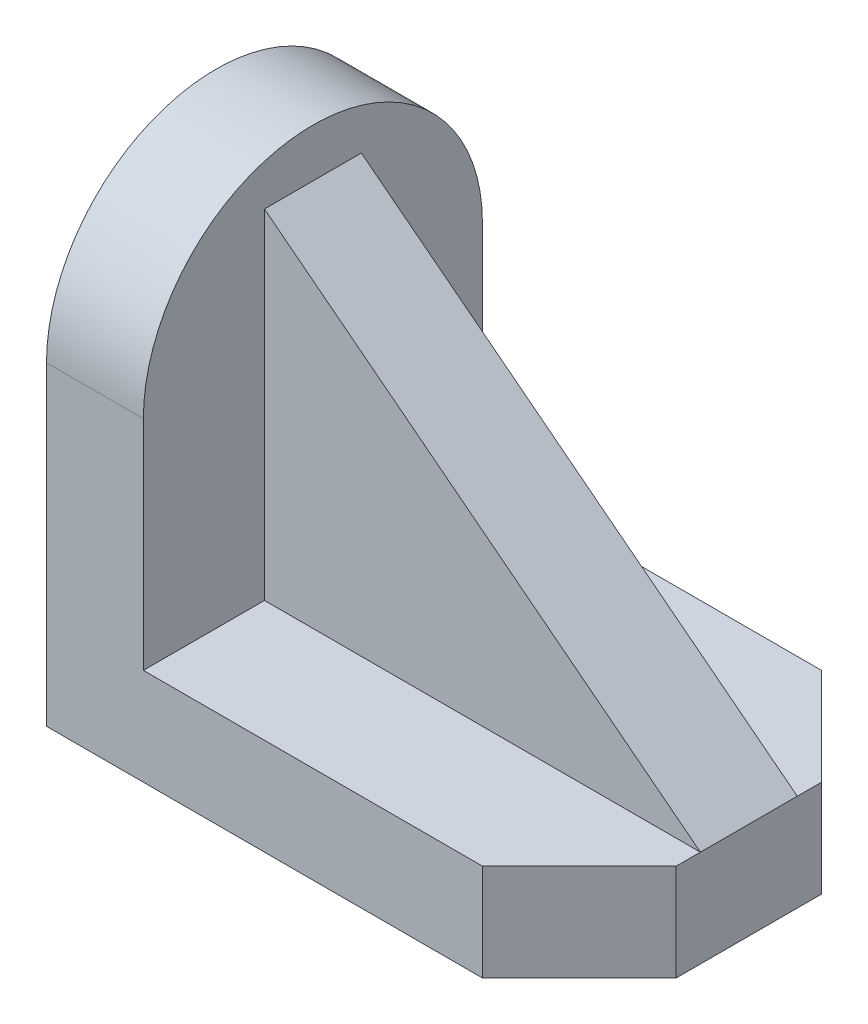
ISO-10303-21;
HEADER;
FILE_DESCRIPTION(('STEP AP214'),'2;1');
FILE_NAME('part.step','',(''),(''),'','','');
FILE_SCHEMA(('AUTOMOTIVE_DESIGN { 1 0 10303 214 1 1 1 1 }'));
ENDSEC;
DATA;
#1=APPLICATION_CONTEXT('core data for automotive mechanical design processes');
#2=APPLICATION_PROTOCOL_DEFINITION('international standard','automotive_design',2000,#1);
#3=PRODUCT_CONTEXT('',#1,'mechanical');
#4=PRODUCT('Part','Part','',(#3));
#5=PRODUCT_RELATED_PRODUCT_CATEGORY('part','',(#4));
#6=PRODUCT_DEFINITION_FORMATION('','',#4);
#7=PRODUCT_DEFINITION_CONTEXT('part definition',#1,'design');
#8=PRODUCT_DEFINITION('design','',#6,#7);
#9=PRODUCT_DEFINITION_SHAPE('','',#8);
#10=(LENGTH_UNIT() NAMED_UNIT(*) SI_UNIT(.MILLI.,.METRE.));
#11=(NAMED_UNIT(*) PLANE_ANGLE_UNIT() SI_UNIT($,.RADIAN.));
#12=(NAMED_UNIT(*) SI_UNIT($,.STERADIAN.) SOLID_ANGLE_UNIT());
#13=UNCERTAINTY_MEASURE_WITH_UNIT(LENGTH_MEASURE(1.E-05),#10,'distance_accuracy_value','');
#14=(GEOMETRIC_REPRESENTATION_CONTEXT(3) GLOBAL_UNCERTAINTY_ASSIGNED_CONTEXT((#13)) GLOBAL_UNIT_ASSIGNED_CONTEXT((#10,
#11,#12)) REPRESENTATION_CONTEXT('',''));
#15=CARTESIAN_POINT('',(0.,0.,0.));
#16=DIRECTION('',(0.,0.,1.));
#17=DIRECTION('',(1.,0.,0.));
#18=AXIS2_PLACEMENT_3D('',#15,#16,#17);
#19=CARTESIAN_POINT('',(0.,120.,0.));
#20=DIRECTION('',(0.,1.,0.));
#21=DIRECTION('',(0.,0.,1.));
#22=AXIS2_PLACEMENT_3D('',#19,#20,#21);
#23=PLANE('',#22);
#24=DIRECTION('',(0.,0.,-1.));
#25=VECTOR('',#24,1.);
#26=CARTESIAN_POINT('',(71.8937155621742,120.,-379.506494580955));
#27=LINE('',#26,#25);
#28=CARTESIAN_POINT('',(71.8937155621742,120.,-229.506494580955));
#29=VERTEX_POINT('',#28);
#30=CARTESIAN_POINT('',(71.8937155621742,120.,-379.506494580955));
#31=VERTEX_POINT('',#30);
#32=EDGE_CURVE('E172',#29,#31,#27,.T.);
#33=ORIENTED_EDGE('',*,*,#32,.F.);
#34=DIRECTION('',(-1.,0.,0.));
#35=VECTOR('',#34,1.);
#36=CARTESIAN_POINT('',(1048.70030891901,120.,-229.506494580955));
#37=LINE('',#36,#35);
#38=CARTESIAN_POINT('',(611.893715562174,120.,-229.506494580955));
#39=VERTEX_POINT('',#38);
#40=EDGE_CURVE('E173',#39,#29,#37,.T.);
#41=ORIENTED_EDGE('',*,*,#40,.F.);
#42=DIRECTION('',(0.,0.,-1.));
#43=VECTOR('',#42,1.);
#44=CARTESIAN_POINT('',(611.893715562174,120.,-379.506494580955));
#45=LINE('',#44,#43);
#46=CARTESIAN_POINT('',(611.893715562174,120.,-259.506494580955));
#47=VERTEX_POINT('',#46);
#48=EDGE_CURVE('E157',#39,#47,#45,.T.);
#49=ORIENTED_EDGE('',*,*,#48,.T.);
#50=DIRECTION('',(0.707106781186548,0.,0.707106781186547));
#51=VECTOR('',#50,1.);
#52=CARTESIAN_POINT('',(435.700105071564,120.,-435.700105071565));
#53=LINE('',#52,#51);
#54=CARTESIAN_POINT('',(491.893715562174,120.,-379.506494580955));
#55=VERTEX_POINT('',#54);
#56=EDGE_CURVE('E13',#47,#55,#53,.F.);
#57=ORIENTED_EDGE('',*,*,#56,.T.);
#58=DIRECTION('',(-1.,0.,0.));
#59=VECTOR('',#58,1.);
#60=CARTESIAN_POINT('',(-48.1062844378258,120.,-379.506494580955));
#61=LINE('',#60,#59);
#62=EDGE_CURVE('E168',#55,#31,#61,.T.);
#63=ORIENTED_EDGE('',*,*,#62,.T.);
#64=EDGE_LOOP('',(#33,#41,#49,#57,#63));
#65=FACE_BOUND('',#64,.T.);
#66=ADVANCED_FACE('F59',(#65),#23,.T.);
#67=CARTESIAN_POINT('',(611.893715562174,120.,-79.5064945809548));
#68=VERTEX_POINT('',#67);
#69=CARTESIAN_POINT('',(611.893715562174,120.,-109.506494580955));
#70=VERTEX_POINT('',#69);
#71=EDGE_CURVE('E155',#68,#70,#45,.T.);
#72=ORIENTED_EDGE('',*,*,#71,.T.);
#73=DIRECTION('',(-1.,0.,0.));
#74=VECTOR('',#73,1.);
#75=CARTESIAN_POINT('',(1048.70030891901,120.,-109.506494580955));
#76=LINE('',#75,#74);
#77=CARTESIAN_POINT('',(71.8937155621742,120.,-109.506494580955));
#78=VERTEX_POINT('',#77);
#79=EDGE_CURVE('E164',#70,#78,#76,.T.);
#80=ORIENTED_EDGE('',*,*,#79,.T.);
#81=CARTESIAN_POINT('',(71.8937155621742,120.,40.4935054190452));
#82=VERTEX_POINT('',#81);
#83=EDGE_CURVE('E175',#82,#78,#27,.T.);
#84=ORIENTED_EDGE('',*,*,#83,.F.);
#85=DIRECTION('',(1.,0.,0.));
#86=VECTOR('',#85,1.);
#87=CARTESIAN_POINT('',(-48.1062844378257,120.,40.4935054190452));
#88=LINE('',#87,#86);
#89=CARTESIAN_POINT('',(491.893715562174,120.,40.4935054190452));
#90=VERTEX_POINT('',#89);
#91=EDGE_CURVE('E187',#82,#90,#88,.T.);
#92=ORIENTED_EDGE('',*,*,#91,.T.);
#93=DIRECTION('',(-0.707106781186547,0.,0.707106781186548));
#94=VECTOR('',#93,1.);
#95=CARTESIAN_POINT('',(266.19361049061,120.,266.19361049061));
#96=LINE('',#95,#94);
#97=EDGE_CURVE('E166',#90,#68,#96,.F.);
#98=ORIENTED_EDGE('',*,*,#97,.T.);
#99=EDGE_LOOP('',(#72,#80,#84,#92,#98));
#100=FACE_BOUND('',#99,.T.);
#101=ADVANCED_FACE('F162',(#100),#23,.T.);
#102=CARTESIAN_POINT('',(71.8937155621742,600.,-379.506494580955));
#103=DIRECTION('',(-1.,0.,0.));
#104=DIRECTION('',(0.,0.,1.));
#105=AXIS2_PLACEMENT_3D('',#102,#103,#104);
#106=PLANE('',#105);
#107=CARTESIAN_POINT('',(71.8937155621742,390.,-169.506494580955));
#108=DIRECTION('',(-1.,0.,0.));
#109=DIRECTION('',(0.,0.,1.));
#110=AXIS2_PLACEMENT_3D('',#107,#108,#109);
#111=CIRCLE('',#110,210.);
#112=CARTESIAN_POINT('',(71.8937155621742,390.,-379.506494580955));
#113=VERTEX_POINT('',#112);
#114=CARTESIAN_POINT('',(71.8937155621743,390.,40.4935054190452));
#115=VERTEX_POINT('',#114);
#116=EDGE_CURVE('E212',#113,#115,#111,.F.);
#117=ORIENTED_EDGE('',*,*,#116,.T.);
#118=DIRECTION('',(0.,-1.,0.));
#119=VECTOR('',#118,1.);
#120=CARTESIAN_POINT('',(71.8937155621743,600.,40.4935054190452));
#121=LINE('',#120,#119);
#122=EDGE_CURVE('E184',#115,#82,#121,.T.);
#123=ORIENTED_EDGE('',*,*,#122,.T.);
#124=ORIENTED_EDGE('',*,*,#83,.T.);
#125=DIRECTION('',(0.,-1.,0.));
#126=VECTOR('',#125,1.);
#127=CARTESIAN_POINT('',(71.8937155621742,120.,-109.506494580955));
#128=LINE('',#127,#126);
#129=CARTESIAN_POINT('',(71.8937155621742,540.,-109.506494580955));
#130=VERTEX_POINT('',#129);
#131=EDGE_CURVE('E171',#130,#78,#128,.T.);
#132=ORIENTED_EDGE('',*,*,#131,.F.);
#133=DIRECTION('',(0.,0.,1.));
#134=VECTOR('',#133,1.);
#135=CARTESIAN_POINT('',(71.8937155621742,540.,-109.506494580955));
#136=LINE('',#135,#134);
#137=CARTESIAN_POINT('',(71.8937155621742,540.,-229.506494580955));
#138=VERTEX_POINT('',#137);
#139=EDGE_CURVE('E75',#138,#130,#136,.T.);
#140=ORIENTED_EDGE('',*,*,#139,.F.);
#141=DIRECTION('',(0.,1.,0.));
#142=VECTOR('',#141,1.);
#143=CARTESIAN_POINT('',(71.8937155621742,540.,-229.506494580955));
#144=LINE('',#143,#142);
#145=EDGE_CURVE('E82',#29,#138,#144,.T.);
#146=ORIENTED_EDGE('',*,*,#145,.F.);
#147=ORIENTED_EDGE('',*,*,#32,.T.);
#148=DIRECTION('',(0.,-1.,0.));
#149=VECTOR('',#148,1.);
#150=CARTESIAN_POINT('',(71.8937155621742,600.,-379.506494580955));
#151=LINE('',#150,#149);
#152=EDGE_CURVE('E181',#113,#31,#151,.T.);
#153=ORIENTED_EDGE('',*,*,#152,.F.);
#154=EDGE_LOOP('',(#117,#123,#124,#132,#140,#146,#147,#153));
#155=FACE_BOUND('',#154,.T.);
#156=ADVANCED_FACE('F258',(#155),#106,.F.);
#157=CARTESIAN_POINT('',(611.893715562174,120.,-259.506494580955));
#158=DIRECTION('',(-0.707106781186547,0.,0.707106781186548));
#159=DIRECTION('',(0.,1.,0.));
#160=AXIS2_PLACEMENT_3D('',#157,#158,#159);
#161=PLANE('',#160);
#162=DIRECTION('',(0.,1.,0.));
#163=VECTOR('',#162,1.);
#164=CARTESIAN_POINT('',(611.893715562174,120.,-259.506494580955));
#165=LINE('',#164,#163);
#166=CARTESIAN_POINT('',(611.893715562174,0.,-259.506494580955));
#167=VERTEX_POINT('',#166);
#168=EDGE_CURVE('E224',#167,#47,#165,.T.);
#169=ORIENTED_EDGE('',*,*,#168,.F.);
#170=DIRECTION('',(-0.707106781186548,0.,-0.707106781186547));
#171=VECTOR('',#170,1.);
#172=CARTESIAN_POINT('',(611.893715562174,0.,-259.506494580955));
#173=LINE('',#172,#171);
#174=CARTESIAN_POINT('',(491.893715562174,0.,-379.506494580955));
#175=VERTEX_POINT('',#174);
#176=EDGE_CURVE('E68',#175,#167,#173,.F.);
#177=ORIENTED_EDGE('',*,*,#176,.F.);
#178=DIRECTION('',(0.,-1.,0.));
#179=VECTOR('',#178,1.);
#180=CARTESIAN_POINT('',(491.893715562174,120.,-379.506494580955));
#181=LINE('',#180,#179);
#182=EDGE_CURVE('E226',#55,#175,#181,.T.);
#183=ORIENTED_EDGE('',*,*,#182,.F.);
#184=ORIENTED_EDGE('',*,*,#56,.F.);
#185=EDGE_LOOP('',(#169,#177,#183,#184));
#186=FACE_BOUND('',#185,.T.);
#187=ADVANCED_FACE('F62',(#186),#161,.F.);
#188=CARTESIAN_POINT('',(491.893715562174,120.,40.4935054190452));
#189=DIRECTION('',(-0.707106781186548,0.,-0.707106781186547));
#190=DIRECTION('',(0.,1.,0.));
#191=AXIS2_PLACEMENT_3D('',#188,#189,#190);
#192=PLANE('',#191);
#193=DIRECTION('',(0.,1.,0.));
#194=VECTOR('',#193,1.);
#195=CARTESIAN_POINT('',(491.893715562174,120.,40.4935054190452));
#196=LINE('',#195,#194);
#197=CARTESIAN_POINT('',(491.893715562174,0.,40.4935054190452));
#198=VERTEX_POINT('',#197);
#199=EDGE_CURVE('E216',#198,#90,#196,.T.);
#200=ORIENTED_EDGE('',*,*,#199,.F.);
#201=DIRECTION('',(0.707106781186547,0.,-0.707106781186548));
#202=VECTOR('',#201,1.);
#203=CARTESIAN_POINT('',(491.893715562174,0.,40.4935054190452));
#204=LINE('',#203,#202);
#205=CARTESIAN_POINT('',(611.893715562174,0.,-79.5064945809548));
#206=VERTEX_POINT('',#205);
#207=EDGE_CURVE('E221',#206,#198,#204,.F.);
#208=ORIENTED_EDGE('',*,*,#207,.F.);
#209=DIRECTION('',(0.,-1.,0.));
#210=VECTOR('',#209,1.);
#211=CARTESIAN_POINT('',(611.893715562174,120.,-79.5064945809548));
#212=LINE('',#211,#210);
#213=EDGE_CURVE('E219',#68,#206,#212,.T.);
#214=ORIENTED_EDGE('',*,*,#213,.F.);
#215=ORIENTED_EDGE('',*,*,#97,.F.);
#216=EDGE_LOOP('',(#200,#208,#214,#215));
#217=FACE_BOUND('',#216,.T.);
#218=ADVANCED_FACE('F239',(#217),#192,.F.);
#219=CARTESIAN_POINT('',(71.8937155621743,390.,-169.506494580955));
#220=DIRECTION('',(1.,0.,0.));
#221=DIRECTION('',(0.,0.,-1.));
#222=AXIS2_PLACEMENT_3D('',#219,#220,#221);
#223=CYLINDRICAL_SURFACE('',#222,210.);
#224=DIRECTION('',(-1.,0.,0.));
#225=VECTOR('',#224,1.);
#226=CARTESIAN_POINT('',(71.8937155621743,390.,40.4935054190452));
#227=LINE('',#226,#225);
#228=CARTESIAN_POINT('',(-48.1062844378257,390.,40.4935054190452));
#229=VERTEX_POINT('',#228);
#230=EDGE_CURVE('E206',#115,#229,#227,.T.);
#231=ORIENTED_EDGE('',*,*,#230,.F.);
#232=ORIENTED_EDGE('',*,*,#116,.F.);
#233=DIRECTION('',(-1.,0.,0.));
#234=VECTOR('',#233,1.);
#235=CARTESIAN_POINT('',(71.8937155621743,390.,-379.506494580955));
#236=LINE('',#235,#234);
#237=CARTESIAN_POINT('',(-48.1062844378258,390.,-379.506494580955));
#238=VERTEX_POINT('',#237);
#239=EDGE_CURVE('E209',#238,#113,#236,.F.);
#240=ORIENTED_EDGE('',*,*,#239,.F.);
#241=CARTESIAN_POINT('',(-48.1062844378258,390.,-169.506494580955));
#242=DIRECTION('',(1.,0.,0.));
#243=DIRECTION('',(0.,0.,-1.));
#244=AXIS2_PLACEMENT_3D('',#241,#242,#243);
#245=CIRCLE('',#244,210.);
#246=EDGE_CURVE('E214',#229,#238,#245,.F.);
#247=ORIENTED_EDGE('',*,*,#246,.F.);
#248=EDGE_LOOP('',(#231,#232,#240,#247));
#249=FACE_BOUND('',#248,.T.);
#250=ADVANCED_FACE('F264',(#249),#223,.T.);
#251=CARTESIAN_POINT('',(-48.1062844378258,120.,-379.506494580955));
#252=DIRECTION('',(1.,0.,0.));
#253=DIRECTION('',(0.,0.,-1.));
#254=AXIS2_PLACEMENT_3D('',#251,#252,#253);
#255=PLANE('',#254);
#256=DIRECTION('',(0.,-1.,0.));
#257=VECTOR('',#256,1.);
#258=CARTESIAN_POINT('',(-48.1062844378257,120.,40.4935054190452));
#259=LINE('',#258,#257);
#260=CARTESIAN_POINT('',(-48.1062844378257,0.,40.4935054190452));
#261=VERTEX_POINT('',#260);
#262=EDGE_CURVE('E204',#229,#261,#259,.T.);
#263=ORIENTED_EDGE('',*,*,#262,.F.);
#264=ORIENTED_EDGE('',*,*,#246,.T.);
#265=DIRECTION('',(0.,-1.,0.));
#266=VECTOR('',#265,1.);
#267=CARTESIAN_POINT('',(-48.1062844378258,120.,-379.506494580955));
#268=LINE('',#267,#266);
#269=CARTESIAN_POINT('',(-48.1062844378258,0.,-379.506494580955));
#270=VERTEX_POINT('',#269);
#271=EDGE_CURVE('E192',#238,#270,#268,.T.);
#272=ORIENTED_EDGE('',*,*,#271,.T.);
#273=DIRECTION('',(0.,0.,1.));
#274=VECTOR('',#273,1.);
#275=CARTESIAN_POINT('',(-48.1062844378258,0.,-379.506494580955));
#276=LINE('',#275,#274);
#277=EDGE_CURVE('E186',#270,#261,#276,.T.);
#278=ORIENTED_EDGE('',*,*,#277,.T.);
#279=EDGE_LOOP('',(#263,#264,#272,#278));
#280=FACE_BOUND('',#279,.T.);
#281=ADVANCED_FACE('F244',(#280),#255,.F.);
#282=CARTESIAN_POINT('',(-48.1062844378257,120.,40.4935054190452));
#283=DIRECTION('',(0.,0.,-1.));
#284=DIRECTION('',(-1.,0.,0.));
#285=AXIS2_PLACEMENT_3D('',#282,#283,#284);
#286=PLANE('',#285);
#287=DIRECTION('',(1.,0.,0.));
#288=VECTOR('',#287,1.);
#289=CARTESIAN_POINT('',(-48.1062844378257,0.,40.4935054190452));
#290=LINE('',#289,#288);
#291=EDGE_CURVE('E195',#261,#198,#290,.T.);
#292=ORIENTED_EDGE('',*,*,#291,.T.);
#293=ORIENTED_EDGE('',*,*,#199,.T.);
#294=ORIENTED_EDGE('',*,*,#91,.F.);
#295=ORIENTED_EDGE('',*,*,#122,.F.);
#296=ORIENTED_EDGE('',*,*,#230,.T.);
#297=ORIENTED_EDGE('',*,*,#262,.T.);
#298=EDGE_LOOP('',(#292,#293,#294,#295,#296,#297));
#299=FACE_BOUND('',#298,.T.);
#300=ADVANCED_FACE('F261',(#299),#286,.F.);
#301=CARTESIAN_POINT('',(611.893715562174,120.,-379.506494580955));
#302=DIRECTION('',(-1.,0.,0.));
#303=DIRECTION('',(0.,0.,1.));
#304=AXIS2_PLACEMENT_3D('',#301,#302,#303);
#305=PLANE('',#304);
#306=ORIENTED_EDGE('',*,*,#48,.F.);
#307=DIRECTION('',(0.,0.,1.));
#308=VECTOR('',#307,1.);
#309=CARTESIAN_POINT('',(611.893715562174,120.,-589.506494580955));
#310=LINE('',#309,#308);
#311=EDGE_CURVE('E142',#39,#70,#310,.T.);
#312=ORIENTED_EDGE('',*,*,#311,.T.);
#313=ORIENTED_EDGE('',*,*,#71,.F.);
#314=ORIENTED_EDGE('',*,*,#213,.T.);
#315=DIRECTION('',(0.,0.,-1.));
#316=VECTOR('',#315,1.);
#317=CARTESIAN_POINT('',(611.893715562174,0.,-379.506494580955));
#318=LINE('',#317,#316);
#319=EDGE_CURVE('E198',#206,#167,#318,.T.);
#320=ORIENTED_EDGE('',*,*,#319,.T.);
#321=ORIENTED_EDGE('',*,*,#168,.T.);
#322=EDGE_LOOP('',(#306,#312,#313,#314,#320,#321));
#323=FACE_BOUND('',#322,.T.);
#324=ADVANCED_FACE('F153',(#323),#305,.F.);
#325=CARTESIAN_POINT('',(-48.1062844378258,120.,-379.506494580955));
#326=DIRECTION('',(0.,0.,1.));
#327=DIRECTION('',(1.,0.,0.));
#328=AXIS2_PLACEMENT_3D('',#325,#326,#327);
#329=PLANE('',#328);
#330=ORIENTED_EDGE('',*,*,#62,.F.);
#331=ORIENTED_EDGE('',*,*,#182,.T.);
#332=DIRECTION('',(-1.,0.,0.));
#333=VECTOR('',#332,1.);
#334=CARTESIAN_POINT('',(-48.1062844378258,0.,-379.506494580955));
#335=LINE('',#334,#333);
#336=EDGE_CURVE('E188',#175,#270,#335,.T.);
#337=ORIENTED_EDGE('',*,*,#336,.T.);
#338=ORIENTED_EDGE('',*,*,#271,.F.);
#339=ORIENTED_EDGE('',*,*,#239,.T.);
#340=ORIENTED_EDGE('',*,*,#152,.T.);
#341=EDGE_LOOP('',(#330,#331,#337,#338,#339,#340));
#342=FACE_BOUND('',#341,.T.);
#343=ADVANCED_FACE('F249',(#342),#329,.F.);
#344=CARTESIAN_POINT('',(0.,0.,0.));
#345=DIRECTION('',(0.,1.,0.));
#346=DIRECTION('',(0.,0.,1.));
#347=AXIS2_PLACEMENT_3D('',#344,#345,#346);
#348=PLANE('',#347);
#349=ORIENTED_EDGE('',*,*,#336,.F.);
#350=ORIENTED_EDGE('',*,*,#176,.T.);
#351=ORIENTED_EDGE('',*,*,#319,.F.);
#352=ORIENTED_EDGE('',*,*,#207,.T.);
#353=ORIENTED_EDGE('',*,*,#291,.F.);
#354=ORIENTED_EDGE('',*,*,#277,.F.);
#355=EDGE_LOOP('',(#349,#350,#351,#352,#353,#354));
#356=FACE_BOUND('',#355,.T.);
#357=ADVANCED_FACE('F232',(#356),#348,.F.);
#358=CARTESIAN_POINT('',(1048.70030891901,540.,-229.506494580955));
#359=DIRECTION('',(0.,0.,1.));
#360=DIRECTION('',(1.,0.,0.));
#361=AXIS2_PLACEMENT_3D('',#358,#359,#360);
#362=PLANE('',#361);
#363=ORIENTED_EDGE('',*,*,#145,.T.);
#364=DIRECTION('',(0.789352217376326,-0.61394061351492,0.));
#365=VECTOR('',#364,1.);
#366=CARTESIAN_POINT('',(680.5193621922,66.6244970655357,-229.506494580955));
#367=LINE('',#366,#365);
#368=EDGE_CURVE('E158',#138,#39,#367,.T.);
#369=ORIENTED_EDGE('',*,*,#368,.T.);
#370=ORIENTED_EDGE('',*,*,#40,.T.);
#371=EDGE_LOOP('',(#363,#369,#370));
#372=FACE_BOUND('',#371,.T.);
#373=ADVANCED_FACE('F254',(#372),#362,.F.);
#374=CARTESIAN_POINT('',(1048.70030891901,120.,-109.506494580955));
#375=DIRECTION('',(0.,0.,-1.));
#376=DIRECTION('',(-1.,0.,0.));
#377=AXIS2_PLACEMENT_3D('',#374,#375,#376);
#378=PLANE('',#377);
#379=ORIENTED_EDGE('',*,*,#79,.F.);
#380=DIRECTION('',(0.789352217376326,-0.61394061351492,0.));
#381=VECTOR('',#380,1.);
#382=CARTESIAN_POINT('',(288.790708173435,371.302339080131,-109.506494580955));
#383=LINE('',#382,#381);
#384=EDGE_CURVE('E139',#130,#70,#383,.T.);
#385=ORIENTED_EDGE('',*,*,#384,.F.);
#386=ORIENTED_EDGE('',*,*,#131,.T.);
#387=EDGE_LOOP('',(#379,#385,#386));
#388=FACE_BOUND('',#387,.T.);
#389=ADVANCED_FACE('F170',(#388),#378,.F.);
#390=CARTESIAN_POINT('',(288.790708173435,371.302339080131,-589.506494580955));
#391=DIRECTION('',(-0.61394061351492,-0.789352217376326,0.));
#392=DIRECTION('',(0.789352217376326,-0.61394061351492,0.));
#393=AXIS2_PLACEMENT_3D('',#390,#391,#392);
#394=PLANE('',#393);
#395=ORIENTED_EDGE('',*,*,#139,.T.);
#396=ORIENTED_EDGE('',*,*,#384,.T.);
#397=ORIENTED_EDGE('',*,*,#311,.F.);
#398=ORIENTED_EDGE('',*,*,#368,.F.);
#399=EDGE_LOOP('',(#395,#396,#397,#398));
#400=FACE_BOUND('',#399,.T.);
#401=ADVANCED_FACE('F141',(#400),#394,.F.);
#402=CLOSED_SHELL('',(#66,#101,#156,#187,#218,#250,#281,#300,#324,#343,#357,#373,#389,#401));
#403=MANIFOLD_SOLID_BREP('B2',#402);
#404=ADVANCED_BREP_SHAPE_REPRESENTATION('',(#18,#403),#14);
#405=SHAPE_DEFINITION_REPRESENTATION(#9,#404);
ENDSEC;
END-ISO-10303-21;
